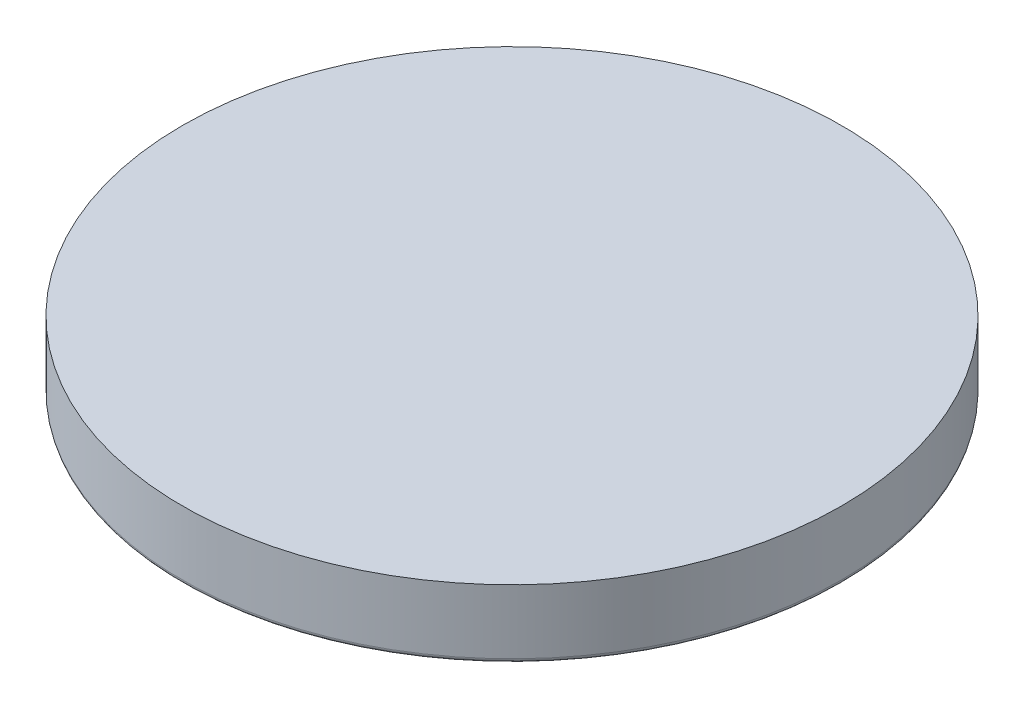
ISO-10303-21;
HEADER;
FILE_DESCRIPTION(('STEP AP214'),'2;1');
FILE_NAME('part.step','',(''),(''),'','','');
FILE_SCHEMA(('AUTOMOTIVE_DESIGN { 1 0 10303 214 1 1 1 1 }'));
ENDSEC;
DATA;
#1=APPLICATION_CONTEXT('core data for automotive mechanical design processes');
#2=APPLICATION_PROTOCOL_DEFINITION('international standard','automotive_design',2000,#1);
#3=PRODUCT_CONTEXT('',#1,'mechanical');
#4=PRODUCT('Part','Part','',(#3));
#5=PRODUCT_RELATED_PRODUCT_CATEGORY('part','',(#4));
#6=PRODUCT_DEFINITION_FORMATION('','',#4);
#7=PRODUCT_DEFINITION_CONTEXT('part definition',#1,'design');
#8=PRODUCT_DEFINITION('design','',#6,#7);
#9=PRODUCT_DEFINITION_SHAPE('','',#8);
#10=(LENGTH_UNIT() NAMED_UNIT(*) SI_UNIT(.MILLI.,.METRE.));
#11=(NAMED_UNIT(*) PLANE_ANGLE_UNIT() SI_UNIT($,.RADIAN.));
#12=(NAMED_UNIT(*) SI_UNIT($,.STERADIAN.) SOLID_ANGLE_UNIT());
#13=UNCERTAINTY_MEASURE_WITH_UNIT(LENGTH_MEASURE(1.E-05),#10,'distance_accuracy_value','');
#14=(GEOMETRIC_REPRESENTATION_CONTEXT(3) GLOBAL_UNCERTAINTY_ASSIGNED_CONTEXT((#13)) GLOBAL_UNIT_ASSIGNED_CONTEXT((#10,
#11,#12)) REPRESENTATION_CONTEXT('',''));
#15=CARTESIAN_POINT('',(0.,0.,0.));
#16=DIRECTION('',(0.,0.,1.));
#17=DIRECTION('',(1.,0.,0.));
#18=AXIS2_PLACEMENT_3D('',#15,#16,#17);
#19=CARTESIAN_POINT('',(0.,91.5228489473484,0.));
#20=DIRECTION('',(0.,-1.,0.));
#21=DIRECTION('',(1.,0.,0.));
#22=AXIS2_PLACEMENT_3D('',#19,#20,#21);
#23=PLANE('',#22);
#24=CARTESIAN_POINT('',(0.,91.5228489473485,0.));
#25=DIRECTION('',(0.,1.,0.));
#26=DIRECTION('',(-1.,0.,0.));
#27=AXIS2_PLACEMENT_3D('',#24,#25,#26);
#28=CIRCLE('',#27,75.1414454213137);
#29=CARTESIAN_POINT('',(-75.1414454213137,91.5228489473484,0.));
#30=VERTEX_POINT('',#29);
#31=EDGE_CURVE('E62',#30,#30,#28,.T.);
#32=ORIENTED_EDGE('',*,*,#31,.T.);
#33=EDGE_LOOP('',(#32));
#34=FACE_BOUND('',#33,.T.);
#35=ADVANCED_FACE('F49',(#34),#23,.F.);
#36=CARTESIAN_POINT('',(0.,91.5228489473484,0.));
#37=DIRECTION('',(0.,1.,0.));
#38=DIRECTION('',(-1.,0.,0.));
#39=AXIS2_PLACEMENT_3D('',#36,#37,#38);
#40=CYLINDRICAL_SURFACE('',#39,75.1414454213137);
#41=CARTESIAN_POINT('',(0.,76.918883127019,0.));
#42=DIRECTION('',(0.,-1.,0.));
#43=DIRECTION('',(1.,0.,0.));
#44=AXIS2_PLACEMENT_3D('',#41,#42,#43);
#45=CIRCLE('',#44,75.1414454213137);
#46=CARTESIAN_POINT('',(75.1414454213137,76.9188831270191,0.));
#47=VERTEX_POINT('',#46);
#48=EDGE_CURVE('E57',#47,#47,#45,.F.);
#49=ORIENTED_EDGE('',*,*,#48,.T.);
#50=EDGE_LOOP('',(#49));
#51=FACE_BOUND('',#50,.T.);
#52=ORIENTED_EDGE('',*,*,#31,.F.);
#53=EDGE_LOOP('',(#52));
#54=FACE_BOUND('',#53,.T.);
#55=ADVANCED_FACE('F86',(#51,#54),#40,.T.);
#56=CARTESIAN_POINT('',(0.,-17.620985451077,0.));
#57=DIRECTION('',(0.,1.,0.));
#58=DIRECTION('',(-1.,0.,0.));
#59=AXIS2_PLACEMENT_3D('',#56,#57,#58);
#60=DEGENERATE_TOROIDAL_SURFACE('',#59,17.7587007871241,109.076340070189,.T.);
#61=CARTESIAN_POINT('',(0.,76.0600258238255,0.));
#62=DIRECTION('',(0.,-1.,0.));
#63=DIRECTION('',(1.,0.,0.));
#64=AXIS2_PLACEMENT_3D('',#61,#62,#63);
#65=CIRCLE('',#64,73.6292304930354);
#66=CARTESIAN_POINT('',(73.6292304930354,76.0600258238255,0.));
#67=VERTEX_POINT('',#66);
#68=EDGE_CURVE('E10',#67,#67,#65,.T.);
#69=ORIENTED_EDGE('',*,*,#68,.T.);
#70=EDGE_LOOP('',(#69));
#71=FACE_BOUND('',#70,.T.);
#72=CARTESIAN_POINT('',(0.,89.5228489473484,0.));
#73=DIRECTION('',(0.,1.,0.));
#74=DIRECTION('',(-1.,0.,0.));
#75=AXIS2_PLACEMENT_3D('',#72,#73,#74);
#76=CIRCLE('',#75,38.2);
#77=CARTESIAN_POINT('',(-38.2,89.5228489473484,0.));
#78=VERTEX_POINT('',#77);
#79=EDGE_CURVE('E67',#78,#78,#76,.T.);
#80=ORIENTED_EDGE('',*,*,#79,.T.);
#81=EDGE_LOOP('',(#80));
#82=FACE_BOUND('',#81,.T.);
#83=ADVANCED_FACE('F74',(#71,#82),#60,.F.);
#84=CARTESIAN_POINT('',(0.,89.5228489473484,0.));
#85=DIRECTION('',(0.,-1.,0.));
#86=DIRECTION('',(1.,0.,0.));
#87=AXIS2_PLACEMENT_3D('',#84,#85,#86);
#88=PLANE('',#87);
#89=ORIENTED_EDGE('',*,*,#79,.F.);
#90=EDGE_LOOP('',(#89));
#91=FACE_BOUND('',#90,.T.);
#92=ADVANCED_FACE('F76',(#91),#88,.T.);
#93=CARTESIAN_POINT('',(0.,76.918883127019,0.));
#94=DIRECTION('',(0.,-1.,0.));
#95=DIRECTION('',(1.,0.,0.));
#96=AXIS2_PLACEMENT_3D('',#93,#94,#95);
#97=TOROIDAL_SURFACE('',#96,74.1414454213137,1.);
#98=ORIENTED_EDGE('',*,*,#68,.F.);
#99=EDGE_LOOP('',(#98));
#100=FACE_BOUND('',#99,.T.);
#101=ORIENTED_EDGE('',*,*,#48,.F.);
#102=EDGE_LOOP('',(#101));
#103=FACE_BOUND('',#102,.T.);
#104=ADVANCED_FACE('F51',(#100,#103),#97,.T.);
#105=CLOSED_SHELL('',(#35,#55,#83,#92,#104));
#106=MANIFOLD_SOLID_BREP('B2',#105);
#107=ADVANCED_BREP_SHAPE_REPRESENTATION('',(#18,#106),#14);
#108=SHAPE_DEFINITION_REPRESENTATION(#9,#107);
ENDSEC;
END-ISO-10303-21;
